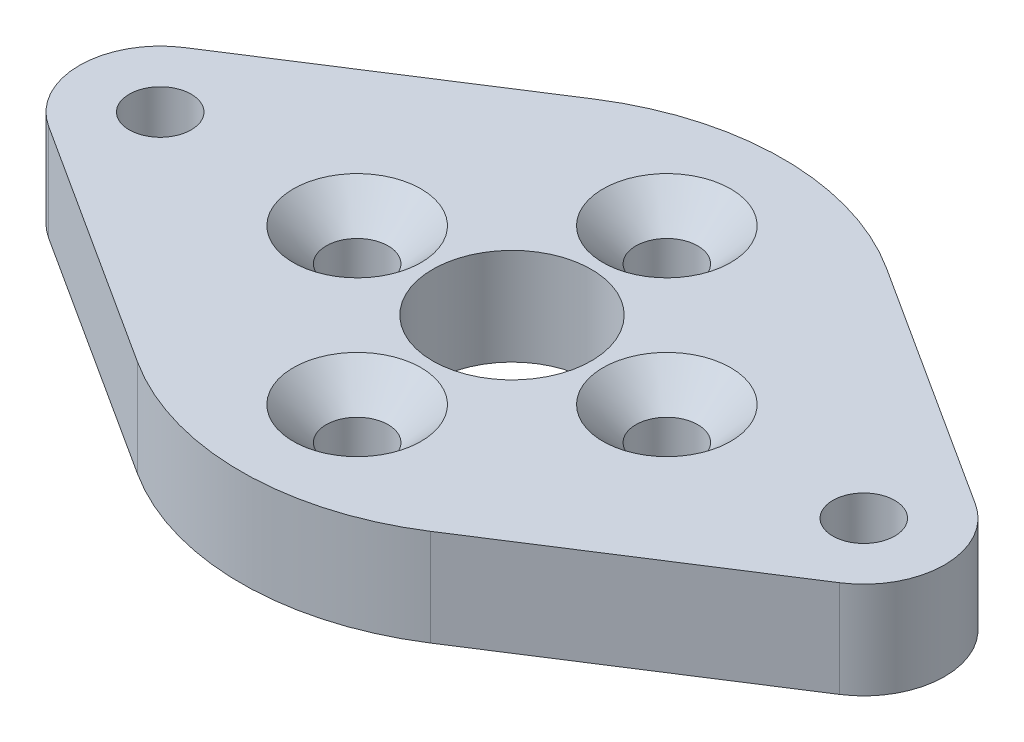
ISO-10303-21;
HEADER;
FILE_DESCRIPTION(('STEP AP214'),'2;1');
FILE_NAME('part.step','',(''),(''),'','','');
FILE_SCHEMA(('AUTOMOTIVE_DESIGN { 1 0 10303 214 1 1 1 1 }'));
ENDSEC;
DATA;
#1=APPLICATION_CONTEXT('core data for automotive mechanical design processes');
#2=APPLICATION_PROTOCOL_DEFINITION('international standard','automotive_design',2000,#1);
#3=PRODUCT_CONTEXT('',#1,'mechanical');
#4=PRODUCT('Part','Part','',(#3));
#5=PRODUCT_RELATED_PRODUCT_CATEGORY('part','',(#4));
#6=PRODUCT_DEFINITION_FORMATION('','',#4);
#7=PRODUCT_DEFINITION_CONTEXT('part definition',#1,'design');
#8=PRODUCT_DEFINITION('design','',#6,#7);
#9=PRODUCT_DEFINITION_SHAPE('','',#8);
#10=(LENGTH_UNIT() NAMED_UNIT(*) SI_UNIT(.MILLI.,.METRE.));
#11=(NAMED_UNIT(*) PLANE_ANGLE_UNIT() SI_UNIT($,.RADIAN.));
#12=(NAMED_UNIT(*) SI_UNIT($,.STERADIAN.) SOLID_ANGLE_UNIT());
#13=UNCERTAINTY_MEASURE_WITH_UNIT(LENGTH_MEASURE(1.E-05),#10,'distance_accuracy_value','');
#14=(GEOMETRIC_REPRESENTATION_CONTEXT(3) GLOBAL_UNCERTAINTY_ASSIGNED_CONTEXT((#13)) GLOBAL_UNIT_ASSIGNED_CONTEXT((#10,
#11,#12)) REPRESENTATION_CONTEXT('',''));
#15=CARTESIAN_POINT('',(0.,0.,0.));
#16=DIRECTION('',(0.,0.,1.));
#17=DIRECTION('',(1.,0.,0.));
#18=AXIS2_PLACEMENT_3D('',#15,#16,#17);
#19=CARTESIAN_POINT('',(18.1754264805429,5.,0.));
#20=DIRECTION('',(0.,-1.,0.));
#21=DIRECTION('',(0.,0.,-1.));
#22=AXIS2_PLACEMENT_3D('',#19,#20,#21);
#23=PLANE('',#22);
#24=CARTESIAN_POINT('',(8.,5.,0.));
#25=DIRECTION('',(0.,-1.,0.));
#26=DIRECTION('',(0.,0.,-1.));
#27=AXIS2_PLACEMENT_3D('',#24,#25,#26);
#28=CIRCLE('',#27,3.30000000000001);
#29=CARTESIAN_POINT('',(8.,5.,-3.30000000000001));
#30=VERTEX_POINT('',#29);
#31=EDGE_CURVE('E178',#30,#30,#28,.T.);
#32=ORIENTED_EDGE('',*,*,#31,.T.);
#33=EDGE_LOOP('',(#32));
#34=FACE_BOUND('',#33,.T.);
#35=CARTESIAN_POINT('',(0.,5.,-8.));
#36=DIRECTION('',(0.,-1.,0.));
#37=DIRECTION('',(0.,0.,-1.));
#38=AXIS2_PLACEMENT_3D('',#35,#36,#37);
#39=CIRCLE('',#38,3.30000000000001);
#40=CARTESIAN_POINT('',(0.,5.,-11.3));
#41=VERTEX_POINT('',#40);
#42=EDGE_CURVE('E175',#41,#41,#39,.T.);
#43=ORIENTED_EDGE('',*,*,#42,.T.);
#44=EDGE_LOOP('',(#43));
#45=FACE_BOUND('',#44,.T.);
#46=CARTESIAN_POINT('',(-8.,5.,0.));
#47=DIRECTION('',(0.,-1.,0.));
#48=DIRECTION('',(0.,0.,-1.));
#49=AXIS2_PLACEMENT_3D('',#46,#47,#48);
#50=CIRCLE('',#49,3.30000000000001);
#51=CARTESIAN_POINT('',(-8.,5.,-3.30000000000001));
#52=VERTEX_POINT('',#51);
#53=EDGE_CURVE('E172',#52,#52,#50,.T.);
#54=ORIENTED_EDGE('',*,*,#53,.T.);
#55=EDGE_LOOP('',(#54));
#56=FACE_BOUND('',#55,.T.);
#57=CARTESIAN_POINT('',(0.,5.,8.));
#58=DIRECTION('',(0.,-1.,0.));
#59=DIRECTION('',(0.,0.,-1.));
#60=AXIS2_PLACEMENT_3D('',#57,#58,#59);
#61=CIRCLE('',#60,3.30000000000001);
#62=CARTESIAN_POINT('',(0.,5.,4.69999999999999));
#63=VERTEX_POINT('',#62);
#64=EDGE_CURVE('E169',#63,#63,#61,.T.);
#65=ORIENTED_EDGE('',*,*,#64,.T.);
#66=EDGE_LOOP('',(#65));
#67=FACE_BOUND('',#66,.T.);
#68=CARTESIAN_POINT('',(18.1754264805429,5.,0.));
#69=DIRECTION('',(0.,1.,0.));
#70=DIRECTION('',(0.,0.,-1.));
#71=AXIS2_PLACEMENT_3D('',#68,#69,#70);
#72=CIRCLE('',#71,4.17542648054294);
#73=CARTESIAN_POINT('',(20.4324180552439,5.,3.51285856905002));
#74=VERTEX_POINT('',#73);
#75=CARTESIAN_POINT('',(20.4324180552439,5.,-3.51285856905002));
#76=VERTEX_POINT('',#75);
#77=EDGE_CURVE('E151',#74,#76,#72,.T.);
#78=ORIENTED_EDGE('',*,*,#77,.T.);
#79=DIRECTION('',(-0.841317308643699,0.,-0.540541567482579));
#80=VECTOR('',#79,1.);
#81=CARTESIAN_POINT('',(20.4324180552439,5.,-3.51285856905002));
#82=LINE('',#81,#80);
#83=CARTESIAN_POINT('',(7.56758194475611,5.,-11.7784423210118));
#84=VERTEX_POINT('',#83);
#85=EDGE_CURVE('E99',#76,#84,#82,.T.);
#86=ORIENTED_EDGE('',*,*,#85,.T.);
#87=CARTESIAN_POINT('',(0.,5.,0.));
#88=DIRECTION('',(0.,1.,0.));
#89=DIRECTION('',(0.,0.,1.));
#90=AXIS2_PLACEMENT_3D('',#87,#88,#89);
#91=CIRCLE('',#90,14.);
#92=CARTESIAN_POINT('',(-7.56758194475611,5.,-11.7784423210118));
#93=VERTEX_POINT('',#92);
#94=EDGE_CURVE('E251',#84,#93,#91,.T.);
#95=ORIENTED_EDGE('',*,*,#94,.T.);
#96=DIRECTION('',(-0.841317308643699,0.,0.540541567482579));
#97=VECTOR('',#96,1.);
#98=CARTESIAN_POINT('',(-20.4324180552439,5.,-3.51285856905002));
#99=LINE('',#98,#97);
#100=CARTESIAN_POINT('',(-20.4324180552439,5.,-3.51285856905002));
#101=VERTEX_POINT('',#100);
#102=EDGE_CURVE('E253',#93,#101,#99,.T.);
#103=ORIENTED_EDGE('',*,*,#102,.T.);
#104=CARTESIAN_POINT('',(-18.1754264805429,5.,0.));
#105=DIRECTION('',(0.,1.,0.));
#106=DIRECTION('',(0.,0.,1.));
#107=AXIS2_PLACEMENT_3D('',#104,#105,#106);
#108=CIRCLE('',#107,4.17542648054294);
#109=CARTESIAN_POINT('',(-20.4324180552439,5.,3.51285856905002));
#110=VERTEX_POINT('',#109);
#111=EDGE_CURVE('E118',#101,#110,#108,.T.);
#112=ORIENTED_EDGE('',*,*,#111,.T.);
#113=DIRECTION('',(0.841317308643699,0.,0.540541567482579));
#114=VECTOR('',#113,1.);
#115=CARTESIAN_POINT('',(-20.4324180552439,5.,3.51285856905002));
#116=LINE('',#115,#114);
#117=CARTESIAN_POINT('',(-7.5675819447561,5.,11.7784423210118));
#118=VERTEX_POINT('',#117);
#119=EDGE_CURVE('E112',#110,#118,#116,.T.);
#120=ORIENTED_EDGE('',*,*,#119,.T.);
#121=CARTESIAN_POINT('',(0.,5.,0.));
#122=DIRECTION('',(0.,1.,0.));
#123=DIRECTION('',(0.,0.,1.));
#124=AXIS2_PLACEMENT_3D('',#121,#122,#123);
#125=CIRCLE('',#124,14.);
#126=CARTESIAN_POINT('',(7.56758194475611,5.,11.7784423210118));
#127=VERTEX_POINT('',#126);
#128=EDGE_CURVE('E116',#118,#127,#125,.T.);
#129=ORIENTED_EDGE('',*,*,#128,.T.);
#130=DIRECTION('',(0.841317308643699,0.,-0.540541567482579));
#131=VECTOR('',#130,1.);
#132=CARTESIAN_POINT('',(20.4324180552439,5.,3.51285856905002));
#133=LINE('',#132,#131);
#134=EDGE_CURVE('E55',#127,#74,#133,.T.);
#135=ORIENTED_EDGE('',*,*,#134,.T.);
#136=EDGE_LOOP('',(#78,#86,#95,#103,#112,#120,#129,#135));
#137=FACE_BOUND('',#136,.T.);
#138=CARTESIAN_POINT('',(0.,5.,0.));
#139=DIRECTION('',(0.,1.,0.));
#140=DIRECTION('',(0.,0.,1.));
#141=AXIS2_PLACEMENT_3D('',#138,#139,#140);
#142=CIRCLE('',#141,4.1);
#143=CARTESIAN_POINT('',(0.,5.,4.1));
#144=VERTEX_POINT('',#143);
#145=EDGE_CURVE('E140',#144,#144,#142,.T.);
#146=ORIENTED_EDGE('',*,*,#145,.F.);
#147=EDGE_LOOP('',(#146));
#148=FACE_BOUND('',#147,.T.);
#149=CARTESIAN_POINT('',(-18.1754264805429,5.,0.));
#150=DIRECTION('',(0.,1.,0.));
#151=DIRECTION('',(0.,0.,1.));
#152=AXIS2_PLACEMENT_3D('',#149,#150,#151);
#153=CIRCLE('',#152,1.6);
#154=CARTESIAN_POINT('',(-18.1754264805429,5.,1.6));
#155=VERTEX_POINT('',#154);
#156=EDGE_CURVE('E236',#155,#155,#153,.T.);
#157=ORIENTED_EDGE('',*,*,#156,.F.);
#158=EDGE_LOOP('',(#157));
#159=FACE_BOUND('',#158,.T.);
#160=CARTESIAN_POINT('',(18.1754264805429,5.,0.));
#161=DIRECTION('',(0.,1.,0.));
#162=DIRECTION('',(0.,0.,1.));
#163=AXIS2_PLACEMENT_3D('',#160,#161,#162);
#164=CIRCLE('',#163,1.6);
#165=CARTESIAN_POINT('',(18.1754264805429,5.,1.59999999999999));
#166=VERTEX_POINT('',#165);
#167=EDGE_CURVE('E240',#166,#166,#164,.T.);
#168=ORIENTED_EDGE('',*,*,#167,.F.);
#169=EDGE_LOOP('',(#168));
#170=FACE_BOUND('',#169,.T.);
#171=ADVANCED_FACE('F37',(#34,#45,#56,#67,#137,#148,#159,#170),#23,.F.);
#172=CARTESIAN_POINT('',(18.1754264805429,0.,0.));
#173=DIRECTION('',(0.,-1.,0.));
#174=DIRECTION('',(0.,0.,-1.));
#175=AXIS2_PLACEMENT_3D('',#172,#173,#174);
#176=PLANE('',#175);
#177=CARTESIAN_POINT('',(18.1754264805429,0.,0.));
#178=DIRECTION('',(0.,-1.,0.));
#179=DIRECTION('',(0.,0.,-1.));
#180=AXIS2_PLACEMENT_3D('',#177,#178,#179);
#181=CIRCLE('',#180,3.30000000000001);
#182=CARTESIAN_POINT('',(18.1754264805429,0.,-3.30000000000002));
#183=VERTEX_POINT('',#182);
#184=EDGE_CURVE('E193',#183,#183,#181,.F.);
#185=ORIENTED_EDGE('',*,*,#184,.T.);
#186=EDGE_LOOP('',(#185));
#187=FACE_BOUND('',#186,.T.);
#188=CARTESIAN_POINT('',(-18.1754264805429,0.,0.));
#189=DIRECTION('',(0.,-1.,0.));
#190=DIRECTION('',(0.,0.,-1.));
#191=AXIS2_PLACEMENT_3D('',#188,#189,#190);
#192=CIRCLE('',#191,3.30000000000001);
#193=CARTESIAN_POINT('',(-18.1754264805429,0.,-3.30000000000001));
#194=VERTEX_POINT('',#193);
#195=EDGE_CURVE('E190',#194,#194,#192,.F.);
#196=ORIENTED_EDGE('',*,*,#195,.T.);
#197=EDGE_LOOP('',(#196));
#198=FACE_BOUND('',#197,.T.);
#199=CARTESIAN_POINT('',(-8.,0.,0.));
#200=DIRECTION('',(0.,1.,0.));
#201=DIRECTION('',(0.,0.,1.));
#202=AXIS2_PLACEMENT_3D('',#199,#200,#201);
#203=CIRCLE('',#202,1.6);
#204=CARTESIAN_POINT('',(-8.,0.,1.6));
#205=VERTEX_POINT('',#204);
#206=EDGE_CURVE('E217',#205,#205,#203,.T.);
#207=ORIENTED_EDGE('',*,*,#206,.T.);
#208=EDGE_LOOP('',(#207));
#209=FACE_BOUND('',#208,.T.);
#210=CARTESIAN_POINT('',(0.,0.,-8.));
#211=DIRECTION('',(0.,1.,0.));
#212=DIRECTION('',(0.,0.,1.));
#213=AXIS2_PLACEMENT_3D('',#210,#211,#212);
#214=CIRCLE('',#213,1.6);
#215=CARTESIAN_POINT('',(0.,0.,-6.4));
#216=VERTEX_POINT('',#215);
#217=EDGE_CURVE('E221',#216,#216,#214,.T.);
#218=ORIENTED_EDGE('',*,*,#217,.T.);
#219=EDGE_LOOP('',(#218));
#220=FACE_BOUND('',#219,.T.);
#221=CARTESIAN_POINT('',(18.1754264805429,0.,0.));
#222=DIRECTION('',(0.,1.,0.));
#223=DIRECTION('',(0.,0.,-1.));
#224=AXIS2_PLACEMENT_3D('',#221,#222,#223);
#225=CIRCLE('',#224,4.17542648054294);
#226=CARTESIAN_POINT('',(20.4324180552439,0.,3.51285856905002));
#227=VERTEX_POINT('',#226);
#228=CARTESIAN_POINT('',(20.4324180552439,0.,-3.51285856905002));
#229=VERTEX_POINT('',#228);
#230=EDGE_CURVE('E136',#227,#229,#225,.T.);
#231=ORIENTED_EDGE('',*,*,#230,.F.);
#232=DIRECTION('',(0.841317308643699,0.,-0.540541567482579));
#233=VECTOR('',#232,1.);
#234=CARTESIAN_POINT('',(20.4324180552439,0.,3.51285856905002));
#235=LINE('',#234,#233);
#236=CARTESIAN_POINT('',(7.56758194475611,0.,11.7784423210118));
#237=VERTEX_POINT('',#236);
#238=EDGE_CURVE('E90',#237,#227,#235,.T.);
#239=ORIENTED_EDGE('',*,*,#238,.F.);
#240=CARTESIAN_POINT('',(0.,0.,0.));
#241=DIRECTION('',(0.,1.,0.));
#242=DIRECTION('',(0.,0.,1.));
#243=AXIS2_PLACEMENT_3D('',#240,#241,#242);
#244=CIRCLE('',#243,14.);
#245=CARTESIAN_POINT('',(-7.5675819447561,0.,11.7784423210118));
#246=VERTEX_POINT('',#245);
#247=EDGE_CURVE('E84',#246,#237,#244,.T.);
#248=ORIENTED_EDGE('',*,*,#247,.F.);
#249=DIRECTION('',(0.841317308643699,0.,0.540541567482579));
#250=VECTOR('',#249,1.);
#251=CARTESIAN_POINT('',(-20.4324180552439,0.,3.51285856905002));
#252=LINE('',#251,#250);
#253=CARTESIAN_POINT('',(-20.4324180552439,0.,3.51285856905002));
#254=VERTEX_POINT('',#253);
#255=EDGE_CURVE('E126',#254,#246,#252,.T.);
#256=ORIENTED_EDGE('',*,*,#255,.F.);
#257=CARTESIAN_POINT('',(-18.1754264805429,0.,0.));
#258=DIRECTION('',(0.,1.,0.));
#259=DIRECTION('',(0.,0.,1.));
#260=AXIS2_PLACEMENT_3D('',#257,#258,#259);
#261=CIRCLE('',#260,4.17542648054294);
#262=CARTESIAN_POINT('',(-20.4324180552439,0.,-3.51285856905002));
#263=VERTEX_POINT('',#262);
#264=EDGE_CURVE('E146',#263,#254,#261,.T.);
#265=ORIENTED_EDGE('',*,*,#264,.F.);
#266=DIRECTION('',(-0.841317308643699,0.,0.540541567482579));
#267=VECTOR('',#266,1.);
#268=CARTESIAN_POINT('',(-20.4324180552439,0.,-3.51285856905002));
#269=LINE('',#268,#267);
#270=CARTESIAN_POINT('',(-7.56758194475611,0.,-11.7784423210118));
#271=VERTEX_POINT('',#270);
#272=EDGE_CURVE('E144',#271,#263,#269,.T.);
#273=ORIENTED_EDGE('',*,*,#272,.F.);
#274=CARTESIAN_POINT('',(0.,0.,0.));
#275=DIRECTION('',(0.,1.,0.));
#276=DIRECTION('',(0.,0.,1.));
#277=AXIS2_PLACEMENT_3D('',#274,#275,#276);
#278=CIRCLE('',#277,14.);
#279=CARTESIAN_POINT('',(7.56758194475611,0.,-11.7784423210118));
#280=VERTEX_POINT('',#279);
#281=EDGE_CURVE('E142',#280,#271,#278,.T.);
#282=ORIENTED_EDGE('',*,*,#281,.F.);
#283=DIRECTION('',(-0.841317308643699,0.,-0.540541567482579));
#284=VECTOR('',#283,1.);
#285=CARTESIAN_POINT('',(20.4324180552439,0.,-3.51285856905002));
#286=LINE('',#285,#284);
#287=EDGE_CURVE('E139',#229,#280,#286,.T.);
#288=ORIENTED_EDGE('',*,*,#287,.F.);
#289=EDGE_LOOP('',(#231,#239,#248,#256,#265,#273,#282,#288));
#290=FACE_BOUND('',#289,.T.);
#291=CARTESIAN_POINT('',(0.,0.,0.));
#292=DIRECTION('',(0.,1.,0.));
#293=DIRECTION('',(0.,0.,1.));
#294=AXIS2_PLACEMENT_3D('',#291,#292,#293);
#295=CIRCLE('',#294,4.1);
#296=CARTESIAN_POINT('',(0.,0.,4.1));
#297=VERTEX_POINT('',#296);
#298=EDGE_CURVE('E227',#297,#297,#295,.T.);
#299=ORIENTED_EDGE('',*,*,#298,.T.);
#300=EDGE_LOOP('',(#299));
#301=FACE_BOUND('',#300,.T.);
#302=CARTESIAN_POINT('',(8.,0.,0.));
#303=DIRECTION('',(0.,1.,0.));
#304=DIRECTION('',(0.,0.,1.));
#305=AXIS2_PLACEMENT_3D('',#302,#303,#304);
#306=CIRCLE('',#305,1.6);
#307=CARTESIAN_POINT('',(8.,0.,1.6));
#308=VERTEX_POINT('',#307);
#309=EDGE_CURVE('E231',#308,#308,#306,.T.);
#310=ORIENTED_EDGE('',*,*,#309,.T.);
#311=EDGE_LOOP('',(#310));
#312=FACE_BOUND('',#311,.T.);
#313=CARTESIAN_POINT('',(0.,0.,8.));
#314=DIRECTION('',(0.,1.,0.));
#315=DIRECTION('',(0.,0.,1.));
#316=AXIS2_PLACEMENT_3D('',#313,#314,#315);
#317=CIRCLE('',#316,1.6);
#318=CARTESIAN_POINT('',(0.,0.,9.6));
#319=VERTEX_POINT('',#318);
#320=EDGE_CURVE('E234',#319,#319,#317,.T.);
#321=ORIENTED_EDGE('',*,*,#320,.T.);
#322=EDGE_LOOP('',(#321));
#323=FACE_BOUND('',#322,.T.);
#324=ADVANCED_FACE('F207',(#187,#198,#209,#220,#290,#301,#312,#323),#176,.T.);
#325=CARTESIAN_POINT('',(18.1754264805429,5.,0.));
#326=DIRECTION('',(0.,-1.,0.));
#327=DIRECTION('',(0.,0.,-1.));
#328=AXIS2_PLACEMENT_3D('',#325,#326,#327);
#329=CYLINDRICAL_SURFACE('',#328,4.17542648054294);
#330=ORIENTED_EDGE('',*,*,#230,.T.);
#331=DIRECTION('',(0.,-1.,0.));
#332=VECTOR('',#331,1.);
#333=CARTESIAN_POINT('',(20.4324180552439,5.,-3.51285856905002));
#334=LINE('',#333,#332);
#335=EDGE_CURVE('E164',#76,#229,#334,.T.);
#336=ORIENTED_EDGE('',*,*,#335,.F.);
#337=ORIENTED_EDGE('',*,*,#77,.F.);
#338=DIRECTION('',(0.,-1.,0.));
#339=VECTOR('',#338,1.);
#340=CARTESIAN_POINT('',(20.4324180552439,5.,3.51285856905002));
#341=LINE('',#340,#339);
#342=EDGE_CURVE('E132',#74,#227,#341,.T.);
#343=ORIENTED_EDGE('',*,*,#342,.T.);
#344=EDGE_LOOP('',(#330,#336,#337,#343));
#345=FACE_BOUND('',#344,.T.);
#346=ADVANCED_FACE('F210',(#345),#329,.T.);
#347=CARTESIAN_POINT('',(20.4324180552439,5.,-3.51285856905002));
#348=DIRECTION('',(-0.540541567482579,0.,0.841317308643699));
#349=DIRECTION('',(0.841317308643699,0.,0.540541567482579));
#350=AXIS2_PLACEMENT_3D('',#347,#348,#349);
#351=PLANE('',#350);
#352=ORIENTED_EDGE('',*,*,#287,.T.);
#353=DIRECTION('',(0.,-1.,0.));
#354=VECTOR('',#353,1.);
#355=CARTESIAN_POINT('',(7.56758194475611,5.,-11.7784423210118));
#356=LINE('',#355,#354);
#357=EDGE_CURVE('E161',#84,#280,#356,.T.);
#358=ORIENTED_EDGE('',*,*,#357,.F.);
#359=ORIENTED_EDGE('',*,*,#85,.F.);
#360=ORIENTED_EDGE('',*,*,#335,.T.);
#361=EDGE_LOOP('',(#352,#358,#359,#360));
#362=FACE_BOUND('',#361,.T.);
#363=ADVANCED_FACE('F267',(#362),#351,.F.);
#364=CARTESIAN_POINT('',(0.,5.,0.));
#365=DIRECTION('',(0.,-1.,0.));
#366=DIRECTION('',(0.,0.,-1.));
#367=AXIS2_PLACEMENT_3D('',#364,#365,#366);
#368=CYLINDRICAL_SURFACE('',#367,14.);
#369=ORIENTED_EDGE('',*,*,#281,.T.);
#370=DIRECTION('',(0.,-1.,0.));
#371=VECTOR('',#370,1.);
#372=CARTESIAN_POINT('',(-7.56758194475611,5.,-11.7784423210118));
#373=LINE('',#372,#371);
#374=EDGE_CURVE('E158',#93,#271,#373,.T.);
#375=ORIENTED_EDGE('',*,*,#374,.F.);
#376=ORIENTED_EDGE('',*,*,#94,.F.);
#377=ORIENTED_EDGE('',*,*,#357,.T.);
#378=EDGE_LOOP('',(#369,#375,#376,#377));
#379=FACE_BOUND('',#378,.T.);
#380=ADVANCED_FACE('F266',(#379),#368,.T.);
#381=CARTESIAN_POINT('',(-20.4324180552439,5.,-3.51285856905002));
#382=DIRECTION('',(0.540541567482579,0.,0.841317308643699));
#383=DIRECTION('',(0.841317308643699,0.,-0.540541567482579));
#384=AXIS2_PLACEMENT_3D('',#381,#382,#383);
#385=PLANE('',#384);
#386=ORIENTED_EDGE('',*,*,#272,.T.);
#387=DIRECTION('',(0.,-1.,0.));
#388=VECTOR('',#387,1.);
#389=CARTESIAN_POINT('',(-20.4324180552439,5.,-3.51285856905002));
#390=LINE('',#389,#388);
#391=EDGE_CURVE('E155',#101,#263,#390,.T.);
#392=ORIENTED_EDGE('',*,*,#391,.F.);
#393=ORIENTED_EDGE('',*,*,#102,.F.);
#394=ORIENTED_EDGE('',*,*,#374,.T.);
#395=EDGE_LOOP('',(#386,#392,#393,#394));
#396=FACE_BOUND('',#395,.T.);
#397=ADVANCED_FACE('F259',(#396),#385,.F.);
#398=CARTESIAN_POINT('',(-18.1754264805429,5.,0.));
#399=DIRECTION('',(0.,-1.,0.));
#400=DIRECTION('',(0.,0.,-1.));
#401=AXIS2_PLACEMENT_3D('',#398,#399,#400);
#402=CYLINDRICAL_SURFACE('',#401,4.17542648054294);
#403=ORIENTED_EDGE('',*,*,#264,.T.);
#404=DIRECTION('',(0.,-1.,0.));
#405=VECTOR('',#404,1.);
#406=CARTESIAN_POINT('',(-20.4324180552439,5.,3.51285856905002));
#407=LINE('',#406,#405);
#408=EDGE_CURVE('E127',#110,#254,#407,.T.);
#409=ORIENTED_EDGE('',*,*,#408,.F.);
#410=ORIENTED_EDGE('',*,*,#111,.F.);
#411=ORIENTED_EDGE('',*,*,#391,.T.);
#412=EDGE_LOOP('',(#403,#409,#410,#411));
#413=FACE_BOUND('',#412,.T.);
#414=ADVANCED_FACE('F263',(#413),#402,.T.);
#415=CARTESIAN_POINT('',(-20.4324180552439,5.,3.51285856905002));
#416=DIRECTION('',(0.540541567482579,0.,-0.841317308643699));
#417=DIRECTION('',(-0.841317308643699,0.,-0.540541567482579));
#418=AXIS2_PLACEMENT_3D('',#415,#416,#417);
#419=PLANE('',#418);
#420=ORIENTED_EDGE('',*,*,#255,.T.);
#421=DIRECTION('',(0.,-1.,0.));
#422=VECTOR('',#421,1.);
#423=CARTESIAN_POINT('',(-7.5675819447561,5.,11.7784423210118));
#424=LINE('',#423,#422);
#425=EDGE_CURVE('E123',#118,#246,#424,.T.);
#426=ORIENTED_EDGE('',*,*,#425,.F.);
#427=ORIENTED_EDGE('',*,*,#119,.F.);
#428=ORIENTED_EDGE('',*,*,#408,.T.);
#429=EDGE_LOOP('',(#420,#426,#427,#428));
#430=FACE_BOUND('',#429,.T.);
#431=ADVANCED_FACE('F124',(#430),#419,.F.);
#432=CARTESIAN_POINT('',(0.,5.,0.));
#433=DIRECTION('',(0.,-1.,0.));
#434=DIRECTION('',(0.,0.,-1.));
#435=AXIS2_PLACEMENT_3D('',#432,#433,#434);
#436=CYLINDRICAL_SURFACE('',#435,14.);
#437=ORIENTED_EDGE('',*,*,#247,.T.);
#438=DIRECTION('',(0.,-1.,0.));
#439=VECTOR('',#438,1.);
#440=CARTESIAN_POINT('',(7.56758194475611,5.,11.7784423210118));
#441=LINE('',#440,#439);
#442=EDGE_CURVE('E128',#127,#237,#441,.T.);
#443=ORIENTED_EDGE('',*,*,#442,.F.);
#444=ORIENTED_EDGE('',*,*,#128,.F.);
#445=ORIENTED_EDGE('',*,*,#425,.T.);
#446=EDGE_LOOP('',(#437,#443,#444,#445));
#447=FACE_BOUND('',#446,.T.);
#448=ADVANCED_FACE('F130',(#447),#436,.T.);
#449=CARTESIAN_POINT('',(20.4324180552439,5.,3.51285856905002));
#450=DIRECTION('',(-0.540541567482579,0.,-0.841317308643699));
#451=DIRECTION('',(-0.841317308643699,0.,0.540541567482579));
#452=AXIS2_PLACEMENT_3D('',#449,#450,#451);
#453=PLANE('',#452);
#454=ORIENTED_EDGE('',*,*,#238,.T.);
#455=ORIENTED_EDGE('',*,*,#342,.F.);
#456=ORIENTED_EDGE('',*,*,#134,.F.);
#457=ORIENTED_EDGE('',*,*,#442,.T.);
#458=EDGE_LOOP('',(#454,#455,#456,#457));
#459=FACE_BOUND('',#458,.T.);
#460=ADVANCED_FACE('F271',(#459),#453,.F.);
#461=CARTESIAN_POINT('',(0.,5.,0.));
#462=DIRECTION('',(0.,-1.,0.));
#463=DIRECTION('',(0.,0.,-1.));
#464=AXIS2_PLACEMENT_3D('',#461,#462,#463);
#465=CYLINDRICAL_SURFACE('',#464,4.1);
#466=ORIENTED_EDGE('',*,*,#145,.T.);
#467=EDGE_LOOP('',(#466));
#468=FACE_BOUND('',#467,.T.);
#469=ORIENTED_EDGE('',*,*,#298,.F.);
#470=EDGE_LOOP('',(#469));
#471=FACE_BOUND('',#470,.T.);
#472=ADVANCED_FACE('F273',(#468,#471),#465,.F.);
#473=CARTESIAN_POINT('',(0.,5.,-8.));
#474=DIRECTION('',(0.,-1.,0.));
#475=DIRECTION('',(0.,0.,-1.));
#476=AXIS2_PLACEMENT_3D('',#473,#474,#475);
#477=CYLINDRICAL_SURFACE('',#476,1.6);
#478=CARTESIAN_POINT('',(0.,3.3,-8.));
#479=DIRECTION('',(0.,-1.,0.));
#480=DIRECTION('',(0.,0.,-1.));
#481=AXIS2_PLACEMENT_3D('',#478,#479,#480);
#482=CIRCLE('',#481,1.6);
#483=CARTESIAN_POINT('',(0.,3.3,-9.6));
#484=VERTEX_POINT('',#483);
#485=EDGE_CURVE('E181',#484,#484,#482,.F.);
#486=ORIENTED_EDGE('',*,*,#485,.T.);
#487=EDGE_LOOP('',(#486));
#488=FACE_BOUND('',#487,.T.);
#489=ORIENTED_EDGE('',*,*,#217,.F.);
#490=EDGE_LOOP('',(#489));
#491=FACE_BOUND('',#490,.T.);
#492=ADVANCED_FACE('F279',(#488,#491),#477,.F.);
#493=CARTESIAN_POINT('',(8.,5.,0.));
#494=DIRECTION('',(0.,-1.,0.));
#495=DIRECTION('',(0.,0.,-1.));
#496=AXIS2_PLACEMENT_3D('',#493,#494,#495);
#497=CYLINDRICAL_SURFACE('',#496,1.6);
#498=CARTESIAN_POINT('',(8.,3.3,0.));
#499=DIRECTION('',(0.,-1.,0.));
#500=DIRECTION('',(0.,0.,-1.));
#501=AXIS2_PLACEMENT_3D('',#498,#499,#500);
#502=CIRCLE('',#501,1.6);
#503=CARTESIAN_POINT('',(8.,3.3,-1.6));
#504=VERTEX_POINT('',#503);
#505=EDGE_CURVE('E166',#504,#504,#502,.F.);
#506=ORIENTED_EDGE('',*,*,#505,.T.);
#507=EDGE_LOOP('',(#506));
#508=FACE_BOUND('',#507,.T.);
#509=ORIENTED_EDGE('',*,*,#309,.F.);
#510=EDGE_LOOP('',(#509));
#511=FACE_BOUND('',#510,.T.);
#512=ADVANCED_FACE('F292',(#508,#511),#497,.F.);
#513=CARTESIAN_POINT('',(-8.,5.,0.));
#514=DIRECTION('',(0.,-1.,0.));
#515=DIRECTION('',(0.,0.,-1.));
#516=AXIS2_PLACEMENT_3D('',#513,#514,#515);
#517=CYLINDRICAL_SURFACE('',#516,1.6);
#518=CARTESIAN_POINT('',(-8.,3.3,0.));
#519=DIRECTION('',(0.,-1.,0.));
#520=DIRECTION('',(0.,0.,-1.));
#521=AXIS2_PLACEMENT_3D('',#518,#519,#520);
#522=CIRCLE('',#521,1.6);
#523=CARTESIAN_POINT('',(-8.,3.3,-1.6));
#524=VERTEX_POINT('',#523);
#525=EDGE_CURVE('E184',#524,#524,#522,.F.);
#526=ORIENTED_EDGE('',*,*,#525,.T.);
#527=EDGE_LOOP('',(#526));
#528=FACE_BOUND('',#527,.T.);
#529=ORIENTED_EDGE('',*,*,#206,.F.);
#530=EDGE_LOOP('',(#529));
#531=FACE_BOUND('',#530,.T.);
#532=ADVANCED_FACE('F296',(#528,#531),#517,.F.);
#533=CARTESIAN_POINT('',(0.,5.,8.));
#534=DIRECTION('',(0.,-1.,0.));
#535=DIRECTION('',(0.,0.,-1.));
#536=AXIS2_PLACEMENT_3D('',#533,#534,#535);
#537=CYLINDRICAL_SURFACE('',#536,1.6);
#538=CARTESIAN_POINT('',(0.,3.3,8.));
#539=DIRECTION('',(0.,-1.,0.));
#540=DIRECTION('',(0.,0.,-1.));
#541=AXIS2_PLACEMENT_3D('',#538,#539,#540);
#542=CIRCLE('',#541,1.6);
#543=CARTESIAN_POINT('',(0.,3.3,6.4));
#544=VERTEX_POINT('',#543);
#545=EDGE_CURVE('E187',#544,#544,#542,.F.);
#546=ORIENTED_EDGE('',*,*,#545,.T.);
#547=EDGE_LOOP('',(#546));
#548=FACE_BOUND('',#547,.T.);
#549=ORIENTED_EDGE('',*,*,#320,.F.);
#550=EDGE_LOOP('',(#549));
#551=FACE_BOUND('',#550,.T.);
#552=ADVANCED_FACE('F300',(#548,#551),#537,.F.);
#553=CARTESIAN_POINT('',(-18.1754264805429,5.,0.));
#554=DIRECTION('',(0.,-1.,0.));
#555=DIRECTION('',(0.,0.,-1.));
#556=AXIS2_PLACEMENT_3D('',#553,#554,#555);
#557=CYLINDRICAL_SURFACE('',#556,1.6);
#558=CARTESIAN_POINT('',(-18.1754264805429,1.70000000000001,0.));
#559=DIRECTION('',(0.,-1.,0.));
#560=DIRECTION('',(0.,0.,-1.));
#561=AXIS2_PLACEMENT_3D('',#558,#559,#560);
#562=CIRCLE('',#561,1.6);
#563=CARTESIAN_POINT('',(-18.1754264805429,1.70000000000001,-1.6));
#564=VERTEX_POINT('',#563);
#565=EDGE_CURVE('E11',#564,#564,#562,.T.);
#566=ORIENTED_EDGE('',*,*,#565,.T.);
#567=EDGE_LOOP('',(#566));
#568=FACE_BOUND('',#567,.T.);
#569=ORIENTED_EDGE('',*,*,#156,.T.);
#570=EDGE_LOOP('',(#569));
#571=FACE_BOUND('',#570,.T.);
#572=ADVANCED_FACE('F304',(#568,#571),#557,.F.);
#573=CARTESIAN_POINT('',(18.1754264805429,5.,0.));
#574=DIRECTION('',(0.,-1.,0.));
#575=DIRECTION('',(0.,0.,-1.));
#576=AXIS2_PLACEMENT_3D('',#573,#574,#575);
#577=CYLINDRICAL_SURFACE('',#576,1.6);
#578=CARTESIAN_POINT('',(18.1754264805429,1.70000000000001,0.));
#579=DIRECTION('',(0.,-1.,0.));
#580=DIRECTION('',(0.,0.,-1.));
#581=AXIS2_PLACEMENT_3D('',#578,#579,#580);
#582=CIRCLE('',#581,1.6);
#583=CARTESIAN_POINT('',(18.1754264805429,1.70000000000001,-1.60000000000001));
#584=VERTEX_POINT('',#583);
#585=EDGE_CURVE('E47',#584,#584,#582,.T.);
#586=ORIENTED_EDGE('',*,*,#585,.T.);
#587=EDGE_LOOP('',(#586));
#588=FACE_BOUND('',#587,.T.);
#589=ORIENTED_EDGE('',*,*,#167,.T.);
#590=EDGE_LOOP('',(#589));
#591=FACE_BOUND('',#590,.T.);
#592=ADVANCED_FACE('F198',(#588,#591),#577,.F.);
#593=CARTESIAN_POINT('',(8.,3.3,0.));
#594=DIRECTION('',(0.,1.,0.));
#595=DIRECTION('',(0.,0.,1.));
#596=AXIS2_PLACEMENT_3D('',#593,#594,#595);
#597=CONICAL_SURFACE('',#596,1.6,0.785398163397451);
#598=ORIENTED_EDGE('',*,*,#31,.F.);
#599=EDGE_LOOP('',(#598));
#600=FACE_BOUND('',#599,.T.);
#601=ORIENTED_EDGE('',*,*,#505,.F.);
#602=EDGE_LOOP('',(#601));
#603=FACE_BOUND('',#602,.T.);
#604=ADVANCED_FACE('F310',(#600,#603),#597,.F.);
#605=CARTESIAN_POINT('',(0.,3.3,-8.));
#606=DIRECTION('',(0.,1.,0.));
#607=DIRECTION('',(0.,0.,1.));
#608=AXIS2_PLACEMENT_3D('',#605,#606,#607);
#609=CONICAL_SURFACE('',#608,1.6,0.785398163397451);
#610=ORIENTED_EDGE('',*,*,#42,.F.);
#611=EDGE_LOOP('',(#610));
#612=FACE_BOUND('',#611,.T.);
#613=ORIENTED_EDGE('',*,*,#485,.F.);
#614=EDGE_LOOP('',(#613));
#615=FACE_BOUND('',#614,.T.);
#616=ADVANCED_FACE('F314',(#612,#615),#609,.F.);
#617=CARTESIAN_POINT('',(-8.,3.3,0.));
#618=DIRECTION('',(0.,1.,0.));
#619=DIRECTION('',(0.,0.,1.));
#620=AXIS2_PLACEMENT_3D('',#617,#618,#619);
#621=CONICAL_SURFACE('',#620,1.6,0.78539816339745);
#622=ORIENTED_EDGE('',*,*,#53,.F.);
#623=EDGE_LOOP('',(#622));
#624=FACE_BOUND('',#623,.T.);
#625=ORIENTED_EDGE('',*,*,#525,.F.);
#626=EDGE_LOOP('',(#625));
#627=FACE_BOUND('',#626,.T.);
#628=ADVANCED_FACE('F320',(#624,#627),#621,.F.);
#629=CARTESIAN_POINT('',(0.,3.3,8.));
#630=DIRECTION('',(0.,1.,0.));
#631=DIRECTION('',(0.,0.,1.));
#632=AXIS2_PLACEMENT_3D('',#629,#630,#631);
#633=CONICAL_SURFACE('',#632,1.6,0.78539816339745);
#634=ORIENTED_EDGE('',*,*,#64,.F.);
#635=EDGE_LOOP('',(#634));
#636=FACE_BOUND('',#635,.T.);
#637=ORIENTED_EDGE('',*,*,#545,.F.);
#638=EDGE_LOOP('',(#637));
#639=FACE_BOUND('',#638,.T.);
#640=ADVANCED_FACE('F204',(#636,#639),#633,.F.);
#641=CARTESIAN_POINT('',(18.1754264805429,0.,0.));
#642=DIRECTION('',(0.,-1.,0.));
#643=DIRECTION('',(0.,0.,-1.));
#644=AXIS2_PLACEMENT_3D('',#641,#642,#643);
#645=CONICAL_SURFACE('',#644,3.30000000000001,0.785398163397448);
#646=ORIENTED_EDGE('',*,*,#585,.F.);
#647=EDGE_LOOP('',(#646));
#648=FACE_BOUND('',#647,.T.);
#649=ORIENTED_EDGE('',*,*,#184,.F.);
#650=EDGE_LOOP('',(#649));
#651=FACE_BOUND('',#650,.T.);
#652=ADVANCED_FACE('F201',(#648,#651),#645,.F.);
#653=CARTESIAN_POINT('',(-18.1754264805429,0.,0.));
#654=DIRECTION('',(0.,-1.,0.));
#655=DIRECTION('',(0.,0.,-1.));
#656=AXIS2_PLACEMENT_3D('',#653,#654,#655);
#657=CONICAL_SURFACE('',#656,3.30000000000001,0.785398163397448);
#658=ORIENTED_EDGE('',*,*,#565,.F.);
#659=EDGE_LOOP('',(#658));
#660=FACE_BOUND('',#659,.T.);
#661=ORIENTED_EDGE('',*,*,#195,.F.);
#662=EDGE_LOOP('',(#661));
#663=FACE_BOUND('',#662,.T.);
#664=ADVANCED_FACE('F40',(#660,#663),#657,.F.);
#665=CLOSED_SHELL('',(#171,#324,#346,#363,#380,#397,#414,#431,#448,#460,#472,#492,#512,#532,
#552,#572,#592,#604,#616,#628,#640,#652,#664));
#666=MANIFOLD_SOLID_BREP('B2',#665);
#667=ADVANCED_BREP_SHAPE_REPRESENTATION('',(#18,#666),#14);
#668=SHAPE_DEFINITION_REPRESENTATION(#9,#667);
ENDSEC;
END-ISO-10303-21;
